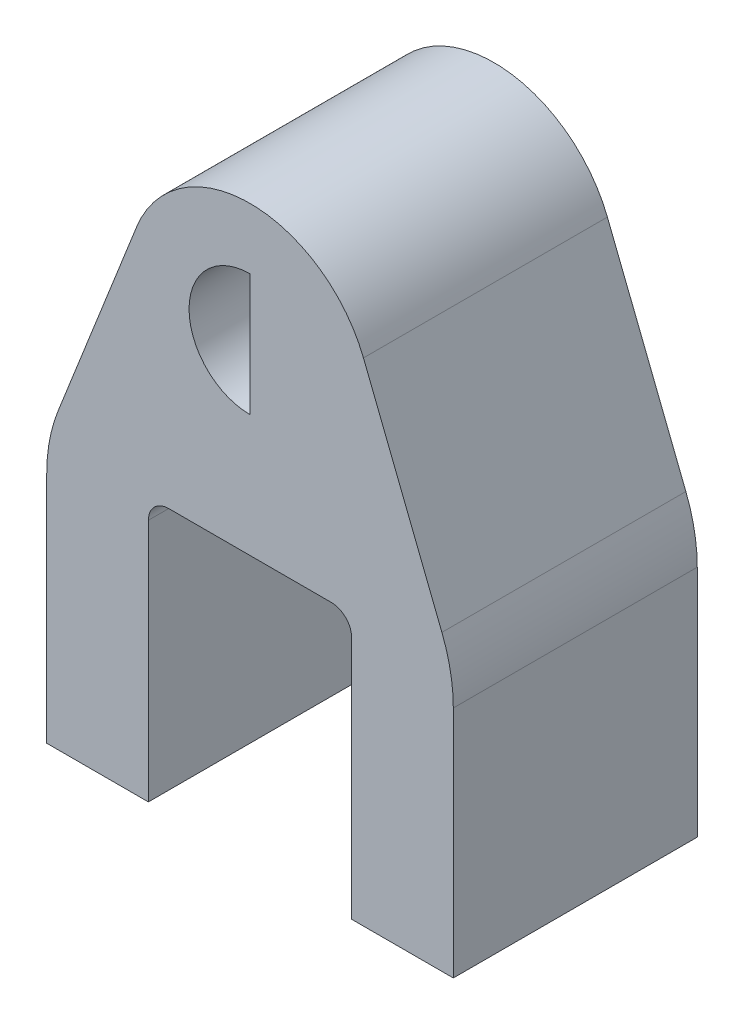
ISO-10303-21;
HEADER;
FILE_DESCRIPTION(('STEP AP214'),'2;1');
FILE_NAME('part.step','',(''),(''),'','','');
FILE_SCHEMA(('AUTOMOTIVE_DESIGN { 1 0 10303 214 1 1 1 1 }'));
ENDSEC;
DATA;
#1=APPLICATION_CONTEXT('core data for automotive mechanical design processes');
#2=APPLICATION_PROTOCOL_DEFINITION('international standard','automotive_design',2000,#1);
#3=PRODUCT_CONTEXT('',#1,'mechanical');
#4=PRODUCT('Part','Part','',(#3));
#5=PRODUCT_RELATED_PRODUCT_CATEGORY('part','',(#4));
#6=PRODUCT_DEFINITION_FORMATION('','',#4);
#7=PRODUCT_DEFINITION_CONTEXT('part definition',#1,'design');
#8=PRODUCT_DEFINITION('design','',#6,#7);
#9=PRODUCT_DEFINITION_SHAPE('','',#8);
#10=(LENGTH_UNIT() NAMED_UNIT(*) SI_UNIT(.MILLI.,.METRE.));
#11=(NAMED_UNIT(*) PLANE_ANGLE_UNIT() SI_UNIT($,.RADIAN.));
#12=(NAMED_UNIT(*) SI_UNIT($,.STERADIAN.) SOLID_ANGLE_UNIT());
#13=UNCERTAINTY_MEASURE_WITH_UNIT(LENGTH_MEASURE(1.E-05),#10,'distance_accuracy_value','');
#14=(GEOMETRIC_REPRESENTATION_CONTEXT(3) GLOBAL_UNCERTAINTY_ASSIGNED_CONTEXT((#13)) GLOBAL_UNIT_ASSIGNED_CONTEXT((#10,
#11,#12)) REPRESENTATION_CONTEXT('',''));
#15=CARTESIAN_POINT('',(0.,0.,0.));
#16=DIRECTION('',(0.,0.,1.));
#17=DIRECTION('',(1.,0.,0.));
#18=AXIS2_PLACEMENT_3D('',#15,#16,#17);
#19=CARTESIAN_POINT('',(12.7,5.3537121843225,19.05));
#20=DIRECTION('',(0.,0.,-1.));
#21=DIRECTION('',(-1.,0.,0.));
#22=AXIS2_PLACEMENT_3D('',#19,#20,#21);
#23=CYLINDRICAL_SURFACE('',#22,3.175);
#24=CARTESIAN_POINT('',(12.7,5.3537121843225,-19.05));
#25=DIRECTION('',(0.,0.,1.));
#26=DIRECTION('',(1.,0.,0.));
#27=AXIS2_PLACEMENT_3D('',#24,#25,#26);
#28=CIRCLE('',#27,3.175);
#29=CARTESIAN_POINT('',(15.875,5.3537121843225,-19.05));
#30=VERTEX_POINT('',#29);
#31=CARTESIAN_POINT('',(12.7,8.5287121843225,-19.05));
#32=VERTEX_POINT('',#31);
#33=EDGE_CURVE('E190',#30,#32,#28,.T.);
#34=ORIENTED_EDGE('',*,*,#33,.F.);
#35=DIRECTION('',(0.,0.,-1.));
#36=VECTOR('',#35,1.);
#37=CARTESIAN_POINT('',(15.875,5.3537121843225,19.05));
#38=LINE('',#37,#36);
#39=CARTESIAN_POINT('',(15.875,5.3537121843225,19.05));
#40=VERTEX_POINT('',#39);
#41=EDGE_CURVE('E11',#40,#30,#38,.T.);
#42=ORIENTED_EDGE('',*,*,#41,.F.);
#43=CARTESIAN_POINT('',(12.7,5.3537121843225,19.05));
#44=DIRECTION('',(0.,0.,1.));
#45=DIRECTION('',(1.,0.,0.));
#46=AXIS2_PLACEMENT_3D('',#43,#44,#45);
#47=CIRCLE('',#46,3.175);
#48=CARTESIAN_POINT('',(12.7,8.5287121843225,19.05));
#49=VERTEX_POINT('',#48);
#50=EDGE_CURVE('E464',#40,#49,#47,.T.);
#51=ORIENTED_EDGE('',*,*,#50,.T.);
#52=DIRECTION('',(0.,0.,-1.));
#53=VECTOR('',#52,1.);
#54=CARTESIAN_POINT('',(12.7,8.5287121843225,19.05));
#55=LINE('',#54,#53);
#56=EDGE_CURVE('E54',#49,#32,#55,.T.);
#57=ORIENTED_EDGE('',*,*,#56,.T.);
#58=EDGE_LOOP('',(#34,#42,#51,#57));
#59=FACE_BOUND('',#58,.T.);
#60=ADVANCED_FACE('F35',(#59),#23,.F.);
#61=CARTESIAN_POINT('',(15.875,0.,19.05));
#62=DIRECTION('',(1.,0.,0.));
#63=DIRECTION('',(0.,0.,-1.));
#64=AXIS2_PLACEMENT_3D('',#61,#62,#63);
#65=PLANE('',#64);
#66=DIRECTION('',(0.,-1.,0.));
#67=VECTOR('',#66,1.);
#68=CARTESIAN_POINT('',(15.875,0.,-19.05));
#69=LINE('',#68,#67);
#70=CARTESIAN_POINT('',(15.875,-32.7462878156775,-19.05));
#71=VERTEX_POINT('',#70);
#72=EDGE_CURVE('E192',#30,#71,#69,.T.);
#73=ORIENTED_EDGE('',*,*,#72,.T.);
#74=DIRECTION('',(0.,0.,-1.));
#75=VECTOR('',#74,1.);
#76=CARTESIAN_POINT('',(15.875,-32.7462878156775,19.05));
#77=LINE('',#76,#75);
#78=CARTESIAN_POINT('',(15.875,-32.7462878156775,19.05));
#79=VERTEX_POINT('',#78);
#80=EDGE_CURVE('E45',#79,#71,#77,.T.);
#81=ORIENTED_EDGE('',*,*,#80,.F.);
#82=DIRECTION('',(0.,-1.,0.));
#83=VECTOR('',#82,1.);
#84=CARTESIAN_POINT('',(15.875,0.,19.05));
#85=LINE('',#84,#83);
#86=EDGE_CURVE('E463',#40,#79,#85,.T.);
#87=ORIENTED_EDGE('',*,*,#86,.F.);
#88=ORIENTED_EDGE('',*,*,#41,.T.);
#89=EDGE_LOOP('',(#73,#81,#87,#88));
#90=FACE_BOUND('',#89,.T.);
#91=ADVANCED_FACE('F275',(#90),#65,.F.);
#92=CARTESIAN_POINT('',(0.,-32.7462878156775,19.05));
#93=DIRECTION('',(0.,1.,0.));
#94=DIRECTION('',(0.,0.,1.));
#95=AXIS2_PLACEMENT_3D('',#92,#93,#94);
#96=PLANE('',#95);
#97=DIRECTION('',(1.,0.,0.));
#98=VECTOR('',#97,1.);
#99=CARTESIAN_POINT('',(0.,-32.7462878156775,-19.05));
#100=LINE('',#99,#98);
#101=CARTESIAN_POINT('',(31.75,-32.7462878156775,-19.05));
#102=VERTEX_POINT('',#101);
#103=EDGE_CURVE('E195',#71,#102,#100,.T.);
#104=ORIENTED_EDGE('',*,*,#103,.T.);
#105=DIRECTION('',(0.,0.,-1.));
#106=VECTOR('',#105,1.);
#107=CARTESIAN_POINT('',(31.75,-32.7462878156775,19.05));
#108=LINE('',#107,#106);
#109=CARTESIAN_POINT('',(31.75,-32.7462878156775,19.05));
#110=VERTEX_POINT('',#109);
#111=EDGE_CURVE('E248',#110,#102,#108,.T.);
#112=ORIENTED_EDGE('',*,*,#111,.F.);
#113=DIRECTION('',(1.,0.,0.));
#114=VECTOR('',#113,1.);
#115=CARTESIAN_POINT('',(0.,-32.7462878156775,19.05));
#116=LINE('',#115,#114);
#117=EDGE_CURVE('E460',#79,#110,#116,.T.);
#118=ORIENTED_EDGE('',*,*,#117,.F.);
#119=ORIENTED_EDGE('',*,*,#80,.T.);
#120=EDGE_LOOP('',(#104,#112,#118,#119));
#121=FACE_BOUND('',#120,.T.);
#122=ADVANCED_FACE('F280',(#121),#96,.F.);
#123=CARTESIAN_POINT('',(31.75,0.,19.05));
#124=DIRECTION('',(-1.,0.,0.));
#125=DIRECTION('',(0.,0.,1.));
#126=AXIS2_PLACEMENT_3D('',#123,#124,#125);
#127=PLANE('',#126);
#128=DIRECTION('',(0.,1.,0.));
#129=VECTOR('',#128,1.);
#130=CARTESIAN_POINT('',(31.75,0.,-19.05));
#131=LINE('',#130,#129);
#132=CARTESIAN_POINT('',(31.75,3.77487289344217,-19.05));
#133=VERTEX_POINT('',#132);
#134=EDGE_CURVE('E198',#102,#133,#131,.T.);
#135=ORIENTED_EDGE('',*,*,#134,.T.);
#136=DIRECTION('',(0.,0.,-1.));
#137=VECTOR('',#136,1.);
#138=CARTESIAN_POINT('',(31.75,3.77487289344217,19.05));
#139=LINE('',#138,#137);
#140=CARTESIAN_POINT('',(31.75,3.77487289344217,19.05));
#141=VERTEX_POINT('',#140);
#142=EDGE_CURVE('E245',#141,#133,#139,.T.);
#143=ORIENTED_EDGE('',*,*,#142,.F.);
#144=DIRECTION('',(0.,1.,0.));
#145=VECTOR('',#144,1.);
#146=CARTESIAN_POINT('',(31.75,0.,19.05));
#147=LINE('',#146,#145);
#148=EDGE_CURVE('E457',#110,#141,#147,.T.);
#149=ORIENTED_EDGE('',*,*,#148,.F.);
#150=ORIENTED_EDGE('',*,*,#111,.T.);
#151=EDGE_LOOP('',(#135,#143,#149,#150));
#152=FACE_BOUND('',#151,.T.);
#153=ADVANCED_FACE('F286',(#152),#127,.F.);
#154=CARTESIAN_POINT('',(6.35,3.77487289344217,19.05));
#155=DIRECTION('',(0.,0.,-1.));
#156=DIRECTION('',(-1.,0.,0.));
#157=AXIS2_PLACEMENT_3D('',#154,#155,#156);
#158=CYLINDRICAL_SURFACE('',#157,25.4);
#159=CARTESIAN_POINT('',(6.35,3.77487289344217,-19.05));
#160=DIRECTION('',(0.,0.,1.));
#161=DIRECTION('',(1.,0.,0.));
#162=AXIS2_PLACEMENT_3D('',#159,#160,#161);
#163=CIRCLE('',#162,25.4);
#164=CARTESIAN_POINT('',(29.9705521257073,13.1145472601824,-19.05));
#165=VERTEX_POINT('',#164);
#166=EDGE_CURVE('E201',#133,#165,#163,.T.);
#167=ORIENTED_EDGE('',*,*,#166,.T.);
#168=DIRECTION('',(0.,0.,-1.));
#169=VECTOR('',#168,1.);
#170=CARTESIAN_POINT('',(29.9705521257073,13.1145472601824,19.05));
#171=LINE('',#170,#169);
#172=CARTESIAN_POINT('',(29.9705521257073,13.1145472601824,19.05));
#173=VERTEX_POINT('',#172);
#174=EDGE_CURVE('E242',#173,#165,#171,.T.);
#175=ORIENTED_EDGE('',*,*,#174,.F.);
#176=CARTESIAN_POINT('',(6.35,3.77487289344217,19.05));
#177=DIRECTION('',(0.,0.,1.));
#178=DIRECTION('',(1.,0.,0.));
#179=AXIS2_PLACEMENT_3D('',#176,#177,#178);
#180=CIRCLE('',#179,25.4);
#181=EDGE_CURVE('E472',#141,#173,#180,.T.);
#182=ORIENTED_EDGE('',*,*,#181,.F.);
#183=ORIENTED_EDGE('',*,*,#142,.T.);
#184=EDGE_LOOP('',(#167,#175,#182,#183));
#185=FACE_BOUND('',#184,.T.);
#186=ADVANCED_FACE('F290',(#185),#158,.T.);
#187=CARTESIAN_POINT('',(30.4027871150565,12.0214011080172,19.05));
#188=DIRECTION('',(-0.92994299707509,-0.367703715225995,0.));
#189=DIRECTION('',(0.367703715225995,-0.92994299707509,0.));
#190=AXIS2_PLACEMENT_3D('',#187,#188,#189);
#191=PLANE('',#190);
#192=DIRECTION('',(-0.367703715225995,0.92994299707509,0.));
#193=VECTOR('',#192,1.);
#194=CARTESIAN_POINT('',(30.4027871150565,12.0214011080172,-19.05));
#195=LINE('',#194,#193);
#196=CARTESIAN_POINT('',(17.7154140942805,44.1084679593777,-19.05));
#197=VERTEX_POINT('',#196);
#198=EDGE_CURVE('E204',#165,#197,#195,.T.);
#199=ORIENTED_EDGE('',*,*,#198,.T.);
#200=DIRECTION('',(0.,0.,-1.));
#201=VECTOR('',#200,1.);
#202=CARTESIAN_POINT('',(17.7154140942805,44.1084679593777,19.05));
#203=LINE('',#202,#201);
#204=CARTESIAN_POINT('',(17.7154140942805,44.1084679593777,19.05));
#205=VERTEX_POINT('',#204);
#206=EDGE_CURVE('E240',#205,#197,#203,.T.);
#207=ORIENTED_EDGE('',*,*,#206,.F.);
#208=DIRECTION('',(-0.367703715225995,0.92994299707509,0.));
#209=VECTOR('',#208,1.);
#210=CARTESIAN_POINT('',(30.4027871150565,12.0214011080172,19.05));
#211=LINE('',#210,#209);
#212=EDGE_CURVE('E452',#173,#205,#211,.T.);
#213=ORIENTED_EDGE('',*,*,#212,.F.);
#214=ORIENTED_EDGE('',*,*,#174,.T.);
#215=EDGE_LOOP('',(#199,#207,#213,#214));
#216=FACE_BOUND('',#215,.T.);
#217=ADVANCED_FACE('F294',(#216),#191,.F.);
#218=CARTESIAN_POINT('',(0.,37.1037121843225,19.05));
#219=DIRECTION('',(0.,0.,-1.));
#220=DIRECTION('',(-1.,0.,0.));
#221=AXIS2_PLACEMENT_3D('',#218,#219,#220);
#222=CYLINDRICAL_SURFACE('',#221,19.05);
#223=CARTESIAN_POINT('',(0.,37.1037121843225,-19.05));
#224=DIRECTION('',(0.,0.,1.));
#225=DIRECTION('',(1.,0.,0.));
#226=AXIS2_PLACEMENT_3D('',#223,#224,#225);
#227=CIRCLE('',#226,19.05);
#228=CARTESIAN_POINT('',(-17.7154140942805,44.1084679593777,-19.05));
#229=VERTEX_POINT('',#228);
#230=EDGE_CURVE('E207',#229,#197,#227,.F.);
#231=ORIENTED_EDGE('',*,*,#230,.F.);
#232=DIRECTION('',(0.,0.,-1.));
#233=VECTOR('',#232,1.);
#234=CARTESIAN_POINT('',(-17.7154140942805,44.1084679593777,19.05));
#235=LINE('',#234,#233);
#236=CARTESIAN_POINT('',(-17.7154140942805,44.1084679593777,19.05));
#237=VERTEX_POINT('',#236);
#238=EDGE_CURVE('E238',#237,#229,#235,.T.);
#239=ORIENTED_EDGE('',*,*,#238,.F.);
#240=CARTESIAN_POINT('',(0.,37.1037121843225,19.05));
#241=DIRECTION('',(0.,0.,1.));
#242=DIRECTION('',(1.,0.,0.));
#243=AXIS2_PLACEMENT_3D('',#240,#241,#242);
#244=CIRCLE('',#243,19.05);
#245=EDGE_CURVE('E450',#237,#205,#244,.F.);
#246=ORIENTED_EDGE('',*,*,#245,.T.);
#247=ORIENTED_EDGE('',*,*,#206,.T.);
#248=EDGE_LOOP('',(#231,#239,#246,#247));
#249=FACE_BOUND('',#248,.T.);
#250=ADVANCED_FACE('F298',(#249),#222,.T.);
#251=CARTESIAN_POINT('',(-30.4027871150565,12.0214011080172,19.05));
#252=DIRECTION('',(-0.92994299707509,0.367703715225995,0.));
#253=DIRECTION('',(-0.367703715225995,-0.92994299707509,0.));
#254=AXIS2_PLACEMENT_3D('',#251,#252,#253);
#255=PLANE('',#254);
#256=DIRECTION('',(0.367703715225995,0.92994299707509,0.));
#257=VECTOR('',#256,1.);
#258=CARTESIAN_POINT('',(-30.4027871150565,12.0214011080172,-19.05));
#259=LINE('',#258,#257);
#260=CARTESIAN_POINT('',(-29.9705521257073,13.1145472601824,-19.05));
#261=VERTEX_POINT('',#260);
#262=EDGE_CURVE('E210',#261,#229,#259,.T.);
#263=ORIENTED_EDGE('',*,*,#262,.F.);
#264=DIRECTION('',(0.,0.,-1.));
#265=VECTOR('',#264,1.);
#266=CARTESIAN_POINT('',(-29.9705521257073,13.1145472601824,19.05));
#267=LINE('',#266,#265);
#268=CARTESIAN_POINT('',(-29.9705521257073,13.1145472601824,19.05));
#269=VERTEX_POINT('',#268);
#270=EDGE_CURVE('E236',#269,#261,#267,.T.);
#271=ORIENTED_EDGE('',*,*,#270,.F.);
#272=DIRECTION('',(0.367703715225995,0.92994299707509,0.));
#273=VECTOR('',#272,1.);
#274=CARTESIAN_POINT('',(-30.4027871150565,12.0214011080172,19.05));
#275=LINE('',#274,#273);
#276=EDGE_CURVE('E476',#269,#237,#275,.T.);
#277=ORIENTED_EDGE('',*,*,#276,.T.);
#278=ORIENTED_EDGE('',*,*,#238,.T.);
#279=EDGE_LOOP('',(#263,#271,#277,#278));
#280=FACE_BOUND('',#279,.T.);
#281=ADVANCED_FACE('F302',(#280),#255,.T.);
#282=CARTESIAN_POINT('',(-6.35,3.77487289344217,19.05));
#283=DIRECTION('',(0.,0.,-1.));
#284=DIRECTION('',(-1.,0.,0.));
#285=AXIS2_PLACEMENT_3D('',#282,#283,#284);
#286=CYLINDRICAL_SURFACE('',#285,25.4);
#287=CARTESIAN_POINT('',(-6.35,3.77487289344217,-19.05));
#288=DIRECTION('',(0.,0.,1.));
#289=DIRECTION('',(1.,0.,0.));
#290=AXIS2_PLACEMENT_3D('',#287,#288,#289);
#291=CIRCLE('',#290,25.4);
#292=CARTESIAN_POINT('',(-31.75,3.77487289344217,-19.05));
#293=VERTEX_POINT('',#292);
#294=EDGE_CURVE('E213',#293,#261,#291,.F.);
#295=ORIENTED_EDGE('',*,*,#294,.F.);
#296=DIRECTION('',(0.,0.,-1.));
#297=VECTOR('',#296,1.);
#298=CARTESIAN_POINT('',(-31.75,3.77487289344217,19.05));
#299=LINE('',#298,#297);
#300=CARTESIAN_POINT('',(-31.75,3.77487289344217,19.05));
#301=VERTEX_POINT('',#300);
#302=EDGE_CURVE('E234',#301,#293,#299,.T.);
#303=ORIENTED_EDGE('',*,*,#302,.F.);
#304=CARTESIAN_POINT('',(-6.35,3.77487289344217,19.05));
#305=DIRECTION('',(0.,0.,1.));
#306=DIRECTION('',(1.,0.,0.));
#307=AXIS2_PLACEMENT_3D('',#304,#305,#306);
#308=CIRCLE('',#307,25.4);
#309=EDGE_CURVE('E443',#301,#269,#308,.F.);
#310=ORIENTED_EDGE('',*,*,#309,.T.);
#311=ORIENTED_EDGE('',*,*,#270,.T.);
#312=EDGE_LOOP('',(#295,#303,#310,#311));
#313=FACE_BOUND('',#312,.T.);
#314=ADVANCED_FACE('F306',(#313),#286,.T.);
#315=CARTESIAN_POINT('',(-31.75,0.,19.05));
#316=DIRECTION('',(-1.,0.,0.));
#317=DIRECTION('',(0.,0.,1.));
#318=AXIS2_PLACEMENT_3D('',#315,#316,#317);
#319=PLANE('',#318);
#320=DIRECTION('',(0.,1.,0.));
#321=VECTOR('',#320,1.);
#322=CARTESIAN_POINT('',(-31.75,0.,-19.05));
#323=LINE('',#322,#321);
#324=CARTESIAN_POINT('',(-31.75,-32.7462878156775,-19.05));
#325=VERTEX_POINT('',#324);
#326=EDGE_CURVE('E216',#325,#293,#323,.T.);
#327=ORIENTED_EDGE('',*,*,#326,.F.);
#328=DIRECTION('',(0.,0.,-1.));
#329=VECTOR('',#328,1.);
#330=CARTESIAN_POINT('',(-31.75,-32.7462878156775,19.05));
#331=LINE('',#330,#329);
#332=CARTESIAN_POINT('',(-31.75,-32.7462878156775,19.05));
#333=VERTEX_POINT('',#332);
#334=EDGE_CURVE('E232',#333,#325,#331,.T.);
#335=ORIENTED_EDGE('',*,*,#334,.F.);
#336=DIRECTION('',(0.,1.,0.));
#337=VECTOR('',#336,1.);
#338=CARTESIAN_POINT('',(-31.75,0.,19.05));
#339=LINE('',#338,#337);
#340=EDGE_CURVE('E439',#333,#301,#339,.T.);
#341=ORIENTED_EDGE('',*,*,#340,.T.);
#342=ORIENTED_EDGE('',*,*,#302,.T.);
#343=EDGE_LOOP('',(#327,#335,#341,#342));
#344=FACE_BOUND('',#343,.T.);
#345=ADVANCED_FACE('F310',(#344),#319,.T.);
#346=CARTESIAN_POINT('',(0.,-32.7462878156775,19.05));
#347=DIRECTION('',(0.,-1.,0.));
#348=DIRECTION('',(0.,0.,-1.));
#349=AXIS2_PLACEMENT_3D('',#346,#347,#348);
#350=PLANE('',#349);
#351=DIRECTION('',(-1.,0.,0.));
#352=VECTOR('',#351,1.);
#353=CARTESIAN_POINT('',(0.,-32.7462878156775,-19.05));
#354=LINE('',#353,#352);
#355=CARTESIAN_POINT('',(-15.875,-32.7462878156775,-19.05));
#356=VERTEX_POINT('',#355);
#357=EDGE_CURVE('E219',#356,#325,#354,.T.);
#358=ORIENTED_EDGE('',*,*,#357,.F.);
#359=DIRECTION('',(0.,0.,-1.));
#360=VECTOR('',#359,1.);
#361=CARTESIAN_POINT('',(-15.875,-32.7462878156775,19.05));
#362=LINE('',#361,#360);
#363=CARTESIAN_POINT('',(-15.875,-32.7462878156775,19.05));
#364=VERTEX_POINT('',#363);
#365=EDGE_CURVE('E164',#364,#356,#362,.T.);
#366=ORIENTED_EDGE('',*,*,#365,.F.);
#367=DIRECTION('',(-1.,0.,0.));
#368=VECTOR('',#367,1.);
#369=CARTESIAN_POINT('',(0.,-32.7462878156775,19.05));
#370=LINE('',#369,#368);
#371=EDGE_CURVE('E175',#364,#333,#370,.T.);
#372=ORIENTED_EDGE('',*,*,#371,.T.);
#373=ORIENTED_EDGE('',*,*,#334,.T.);
#374=EDGE_LOOP('',(#358,#366,#372,#373));
#375=FACE_BOUND('',#374,.T.);
#376=ADVANCED_FACE('F314',(#375),#350,.T.);
#377=CARTESIAN_POINT('',(-15.875,0.,19.05));
#378=DIRECTION('',(1.,0.,0.));
#379=DIRECTION('',(0.,0.,-1.));
#380=AXIS2_PLACEMENT_3D('',#377,#378,#379);
#381=PLANE('',#380);
#382=DIRECTION('',(0.,-1.,0.));
#383=VECTOR('',#382,1.);
#384=CARTESIAN_POINT('',(-15.875,0.,-19.05));
#385=LINE('',#384,#383);
#386=CARTESIAN_POINT('',(-15.875,5.3537121843225,-19.05));
#387=VERTEX_POINT('',#386);
#388=EDGE_CURVE('E160',#387,#356,#385,.T.);
#389=ORIENTED_EDGE('',*,*,#388,.F.);
#390=DIRECTION('',(0.,0.,-1.));
#391=VECTOR('',#390,1.);
#392=CARTESIAN_POINT('',(-15.875,5.3537121843225,19.05));
#393=LINE('',#392,#391);
#394=CARTESIAN_POINT('',(-15.875,5.3537121843225,19.05));
#395=VERTEX_POINT('',#394);
#396=EDGE_CURVE('E155',#395,#387,#393,.T.);
#397=ORIENTED_EDGE('',*,*,#396,.F.);
#398=DIRECTION('',(0.,-1.,0.));
#399=VECTOR('',#398,1.);
#400=CARTESIAN_POINT('',(-15.875,0.,19.05));
#401=LINE('',#400,#399);
#402=EDGE_CURVE('E158',#395,#364,#401,.T.);
#403=ORIENTED_EDGE('',*,*,#402,.T.);
#404=ORIENTED_EDGE('',*,*,#365,.T.);
#405=EDGE_LOOP('',(#389,#397,#403,#404));
#406=FACE_BOUND('',#405,.T.);
#407=ADVANCED_FACE('F157',(#406),#381,.T.);
#408=CARTESIAN_POINT('',(-12.7,5.3537121843225,19.05));
#409=DIRECTION('',(0.,0.,-1.));
#410=DIRECTION('',(-1.,0.,0.));
#411=AXIS2_PLACEMENT_3D('',#408,#409,#410);
#412=CYLINDRICAL_SURFACE('',#411,3.175);
#413=CARTESIAN_POINT('',(-12.7,5.3537121843225,-19.05));
#414=DIRECTION('',(0.,0.,1.));
#415=DIRECTION('',(1.,0.,0.));
#416=AXIS2_PLACEMENT_3D('',#413,#414,#415);
#417=CIRCLE('',#416,3.175);
#418=CARTESIAN_POINT('',(-12.7,8.5287121843225,-19.05));
#419=VERTEX_POINT('',#418);
#420=EDGE_CURVE('E223',#419,#387,#417,.T.);
#421=ORIENTED_EDGE('',*,*,#420,.F.);
#422=DIRECTION('',(0.,0.,-1.));
#423=VECTOR('',#422,1.);
#424=CARTESIAN_POINT('',(-12.7,8.5287121843225,19.05));
#425=LINE('',#424,#423);
#426=CARTESIAN_POINT('',(-12.7,8.5287121843225,19.05));
#427=VERTEX_POINT('',#426);
#428=EDGE_CURVE('E103',#427,#419,#425,.T.);
#429=ORIENTED_EDGE('',*,*,#428,.F.);
#430=CARTESIAN_POINT('',(-12.7,5.3537121843225,19.05));
#431=DIRECTION('',(0.,0.,1.));
#432=DIRECTION('',(1.,0.,0.));
#433=AXIS2_PLACEMENT_3D('',#430,#431,#432);
#434=CIRCLE('',#433,3.175);
#435=EDGE_CURVE('E172',#427,#395,#434,.T.);
#436=ORIENTED_EDGE('',*,*,#435,.T.);
#437=ORIENTED_EDGE('',*,*,#396,.T.);
#438=EDGE_LOOP('',(#421,#429,#436,#437));
#439=FACE_BOUND('',#438,.T.);
#440=ADVANCED_FACE('F177',(#439),#412,.F.);
#441=CARTESIAN_POINT('',(0.,37.1037121843225,19.05));
#442=DIRECTION('',(0.,0.,-1.));
#443=DIRECTION('',(-1.,0.,0.));
#444=AXIS2_PLACEMENT_3D('',#441,#442,#443);
#445=CYLINDRICAL_SURFACE('',#444,9.525);
#446=CARTESIAN_POINT('',(0.,37.1037121843225,-19.05));
#447=DIRECTION('',(0.,0.,1.));
#448=DIRECTION('',(1.,0.,0.));
#449=AXIS2_PLACEMENT_3D('',#446,#447,#448);
#450=CIRCLE('',#449,9.525);
#451=CARTESIAN_POINT('',(0.,46.6287121843225,-19.05));
#452=VERTEX_POINT('',#451);
#453=CARTESIAN_POINT('',(0.,27.5787121843225,-19.05));
#454=VERTEX_POINT('',#453);
#455=EDGE_CURVE('E184',#452,#454,#450,.T.);
#456=ORIENTED_EDGE('',*,*,#455,.F.);
#457=DIRECTION('',(0.,0.,-1.));
#458=VECTOR('',#457,1.);
#459=CARTESIAN_POINT('',(0.,46.6287121843225,19.05));
#460=LINE('',#459,#458);
#461=CARTESIAN_POINT('',(0.,46.6287121843225,19.05));
#462=VERTEX_POINT('',#461);
#463=EDGE_CURVE('E39',#462,#452,#460,.T.);
#464=ORIENTED_EDGE('',*,*,#463,.F.);
#465=CARTESIAN_POINT('',(0.,37.1037121843225,19.05));
#466=DIRECTION('',(0.,0.,1.));
#467=DIRECTION('',(1.,0.,0.));
#468=AXIS2_PLACEMENT_3D('',#465,#466,#467);
#469=CIRCLE('',#468,9.525);
#470=CARTESIAN_POINT('',(0.,27.5787121843225,19.05));
#471=VERTEX_POINT('',#470);
#472=EDGE_CURVE('E228',#462,#471,#469,.T.);
#473=ORIENTED_EDGE('',*,*,#472,.T.);
#474=DIRECTION('',(0.,0.,-1.));
#475=VECTOR('',#474,1.);
#476=CARTESIAN_POINT('',(0.,27.5787121843225,19.05));
#477=LINE('',#476,#475);
#478=EDGE_CURVE('E180',#471,#454,#477,.T.);
#479=ORIENTED_EDGE('',*,*,#478,.T.);
#480=EDGE_LOOP('',(#456,#464,#473,#479));
#481=FACE_BOUND('',#480,.T.);
#482=ADVANCED_FACE('F37',(#481),#445,.F.);
#483=CARTESIAN_POINT('',(0.,0.,19.05));
#484=DIRECTION('',(-1.,0.,0.));
#485=DIRECTION('',(0.,0.,1.));
#486=AXIS2_PLACEMENT_3D('',#483,#484,#485);
#487=PLANE('',#486);
#488=DIRECTION('',(0.,1.,0.));
#489=VECTOR('',#488,1.);
#490=CARTESIAN_POINT('',(0.,0.,-19.05));
#491=LINE('',#490,#489);
#492=EDGE_CURVE('E187',#454,#452,#491,.T.);
#493=ORIENTED_EDGE('',*,*,#492,.F.);
#494=ORIENTED_EDGE('',*,*,#478,.F.);
#495=DIRECTION('',(0.,1.,0.));
#496=VECTOR('',#495,1.);
#497=CARTESIAN_POINT('',(0.,0.,19.05));
#498=LINE('',#497,#496);
#499=EDGE_CURVE('E257',#471,#462,#498,.T.);
#500=ORIENTED_EDGE('',*,*,#499,.T.);
#501=ORIENTED_EDGE('',*,*,#463,.T.);
#502=EDGE_LOOP('',(#493,#494,#500,#501));
#503=FACE_BOUND('',#502,.T.);
#504=ADVANCED_FACE('F255',(#503),#487,.T.);
#505=CARTESIAN_POINT('',(0.,8.5287121843225,19.05));
#506=DIRECTION('',(0.,-1.,0.));
#507=DIRECTION('',(0.,0.,-1.));
#508=AXIS2_PLACEMENT_3D('',#505,#506,#507);
#509=PLANE('',#508);
#510=DIRECTION('',(-1.,0.,0.));
#511=VECTOR('',#510,1.);
#512=CARTESIAN_POINT('',(0.,8.5287121843225,-19.05));
#513=LINE('',#512,#511);
#514=EDGE_CURVE('E225',#32,#419,#513,.T.);
#515=ORIENTED_EDGE('',*,*,#514,.F.);
#516=ORIENTED_EDGE('',*,*,#56,.F.);
#517=DIRECTION('',(-1.,0.,0.));
#518=VECTOR('',#517,1.);
#519=CARTESIAN_POINT('',(0.,8.5287121843225,19.05));
#520=LINE('',#519,#518);
#521=EDGE_CURVE('E178',#49,#427,#520,.T.);
#522=ORIENTED_EDGE('',*,*,#521,.T.);
#523=ORIENTED_EDGE('',*,*,#428,.T.);
#524=EDGE_LOOP('',(#515,#516,#522,#523));
#525=FACE_BOUND('',#524,.T.);
#526=ADVANCED_FACE('F264',(#525),#509,.T.);
#527=CARTESIAN_POINT('',(0.,0.,19.05));
#528=DIRECTION('',(0.,0.,1.));
#529=DIRECTION('',(1.,0.,0.));
#530=AXIS2_PLACEMENT_3D('',#527,#528,#529);
#531=PLANE('',#530);
#532=ORIENTED_EDGE('',*,*,#472,.F.);
#533=ORIENTED_EDGE('',*,*,#499,.F.);
#534=EDGE_LOOP('',(#532,#533));
#535=FACE_BOUND('',#534,.T.);
#536=ORIENTED_EDGE('',*,*,#50,.F.);
#537=ORIENTED_EDGE('',*,*,#86,.T.);
#538=ORIENTED_EDGE('',*,*,#117,.T.);
#539=ORIENTED_EDGE('',*,*,#148,.T.);
#540=ORIENTED_EDGE('',*,*,#181,.T.);
#541=ORIENTED_EDGE('',*,*,#212,.T.);
#542=ORIENTED_EDGE('',*,*,#245,.F.);
#543=ORIENTED_EDGE('',*,*,#276,.F.);
#544=ORIENTED_EDGE('',*,*,#309,.F.);
#545=ORIENTED_EDGE('',*,*,#340,.F.);
#546=ORIENTED_EDGE('',*,*,#371,.F.);
#547=ORIENTED_EDGE('',*,*,#402,.F.);
#548=ORIENTED_EDGE('',*,*,#435,.F.);
#549=ORIENTED_EDGE('',*,*,#521,.F.);
#550=EDGE_LOOP('',(#536,#537,#538,#539,#540,#541,#542,#543,#544,#545,#546,#547,#548,#549));
#551=FACE_BOUND('',#550,.T.);
#552=ADVANCED_FACE('F170',(#535,#551),#531,.T.);
#553=CARTESIAN_POINT('',(0.,0.,-19.05));
#554=DIRECTION('',(0.,0.,1.));
#555=DIRECTION('',(1.,0.,0.));
#556=AXIS2_PLACEMENT_3D('',#553,#554,#555);
#557=PLANE('',#556);
#558=ORIENTED_EDGE('',*,*,#455,.T.);
#559=ORIENTED_EDGE('',*,*,#492,.T.);
#560=EDGE_LOOP('',(#558,#559));
#561=FACE_BOUND('',#560,.T.);
#562=ORIENTED_EDGE('',*,*,#33,.T.);
#563=ORIENTED_EDGE('',*,*,#514,.T.);
#564=ORIENTED_EDGE('',*,*,#420,.T.);
#565=ORIENTED_EDGE('',*,*,#388,.T.);
#566=ORIENTED_EDGE('',*,*,#357,.T.);
#567=ORIENTED_EDGE('',*,*,#326,.T.);
#568=ORIENTED_EDGE('',*,*,#294,.T.);
#569=ORIENTED_EDGE('',*,*,#262,.T.);
#570=ORIENTED_EDGE('',*,*,#230,.T.);
#571=ORIENTED_EDGE('',*,*,#198,.F.);
#572=ORIENTED_EDGE('',*,*,#166,.F.);
#573=ORIENTED_EDGE('',*,*,#134,.F.);
#574=ORIENTED_EDGE('',*,*,#103,.F.);
#575=ORIENTED_EDGE('',*,*,#72,.F.);
#576=EDGE_LOOP('',(#562,#563,#564,#565,#566,#567,#568,#569,#570,#571,#572,#573,#574,#575));
#577=FACE_BOUND('',#576,.T.);
#578=ADVANCED_FACE('F259',(#561,#577),#557,.F.);
#579=CLOSED_SHELL('',(#60,#91,#122,#153,#186,#217,#250,#281,#314,#345,#376,#407,#440,#482,#504,
#526,#552,#578));
#580=MANIFOLD_SOLID_BREP('B2',#579);
#581=ADVANCED_BREP_SHAPE_REPRESENTATION('',(#18,#580),#14);
#582=SHAPE_DEFINITION_REPRESENTATION(#9,#581);
ENDSEC;
END-ISO-10303-21;
